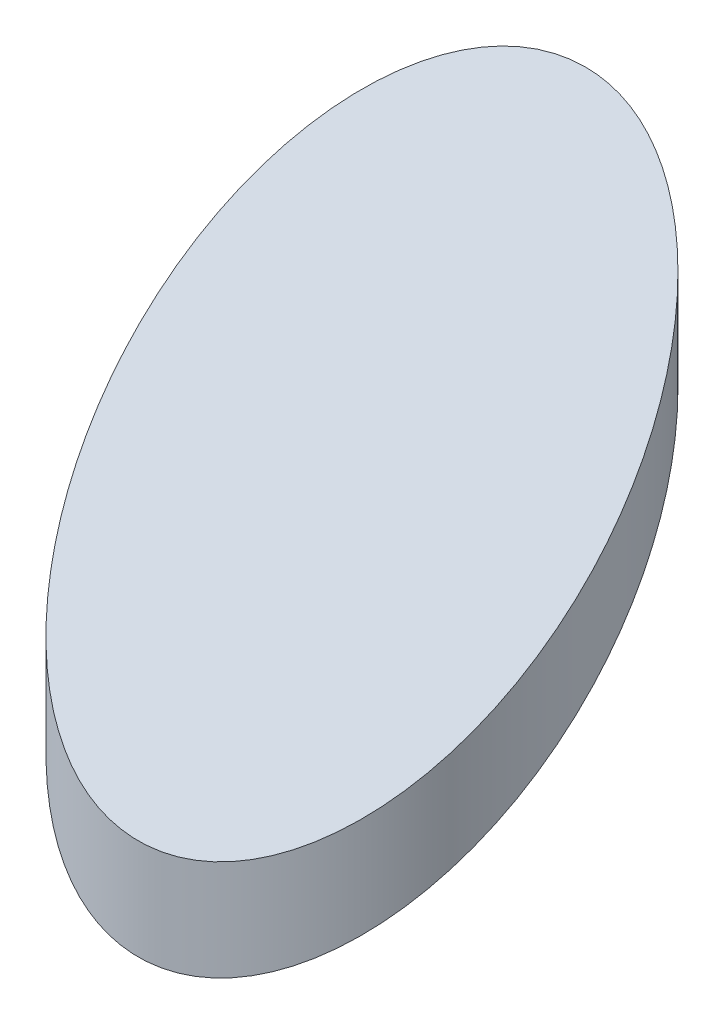
ISO-10303-21;
HEADER;
FILE_DESCRIPTION(('STEP AP214'),'2;1');
FILE_NAME('part.step','',(''),(''),'','','');
FILE_SCHEMA(('AUTOMOTIVE_DESIGN { 1 0 10303 214 1 1 1 1 }'));
ENDSEC;
DATA;
#1=APPLICATION_CONTEXT('core data for automotive mechanical design processes');
#2=APPLICATION_PROTOCOL_DEFINITION('international standard','automotive_design',2000,#1);
#3=PRODUCT_CONTEXT('',#1,'mechanical');
#4=PRODUCT('Part','Part','',(#3));
#5=PRODUCT_RELATED_PRODUCT_CATEGORY('part','',(#4));
#6=PRODUCT_DEFINITION_FORMATION('','',#4);
#7=PRODUCT_DEFINITION_CONTEXT('part definition',#1,'design');
#8=PRODUCT_DEFINITION('design','',#6,#7);
#9=PRODUCT_DEFINITION_SHAPE('','',#8);
#10=(LENGTH_UNIT() NAMED_UNIT(*) SI_UNIT(.MILLI.,.METRE.));
#11=(NAMED_UNIT(*) PLANE_ANGLE_UNIT() SI_UNIT($,.RADIAN.));
#12=(NAMED_UNIT(*) SI_UNIT($,.STERADIAN.) SOLID_ANGLE_UNIT());
#13=UNCERTAINTY_MEASURE_WITH_UNIT(LENGTH_MEASURE(1.E-05),#10,'distance_accuracy_value','');
#14=(GEOMETRIC_REPRESENTATION_CONTEXT(3) GLOBAL_UNCERTAINTY_ASSIGNED_CONTEXT((#13)) GLOBAL_UNIT_ASSIGNED_CONTEXT((#10,
#11,#12)) REPRESENTATION_CONTEXT('',''));
#15=CARTESIAN_POINT('',(0.,0.,0.));
#16=DIRECTION('',(0.,0.,1.));
#17=DIRECTION('',(1.,0.,0.));
#18=AXIS2_PLACEMENT_3D('',#15,#16,#17);
#19=CARTESIAN_POINT('',(0.,14.142135623731,-14.1421356237309));
#20=DIRECTION('',(0.,0.707106781186546,0.707106781186549));
#21=DIRECTION('',(0.,-0.707106781186549,0.707106781186546));
#22=AXIS2_PLACEMENT_3D('',#19,#20,#21);
#23=PLANE('',#22);
#24=CARTESIAN_POINT('',(0.,9.00000000000003,-9.));
#25=DIRECTION('',(0.,0.707106781186546,0.707106781186549));
#26=DIRECTION('',(0.,0.707106781186549,-0.707106781186546));
#27=AXIS2_PLACEMENT_3D('',#24,#25,#26);
#28=ELLIPSE('',#27,8.88126117170305,6.28);
#29=CARTESIAN_POINT('',(0.,15.2800000000001,-15.28));
#30=VERTEX_POINT('',#29);
#31=EDGE_CURVE('E33',#30,#30,#28,.T.);
#32=ORIENTED_EDGE('',*,*,#31,.T.);
#33=EDGE_LOOP('',(#32));
#34=FACE_BOUND('',#33,.T.);
#35=ADVANCED_FACE('F30',(#34),#23,.T.);
#36=CARTESIAN_POINT('',(0.,-1.41421356237309,-9.));
#37=DIRECTION('',(0.,1.,0.));
#38=DIRECTION('',(0.,0.,1.));
#39=AXIS2_PLACEMENT_3D('',#36,#37,#38);
#40=CYLINDRICAL_SURFACE('',#39,6.28);
#41=ORIENTED_EDGE('',*,*,#31,.F.);
#42=EDGE_LOOP('',(#41));
#43=FACE_BOUND('',#42,.T.);
#44=CARTESIAN_POINT('',(0.,6.17157287525384,-9.));
#45=DIRECTION('',(0.,0.707106781186546,0.707106781186549));
#46=DIRECTION('',(0.,0.707106781186549,-0.707106781186546));
#47=AXIS2_PLACEMENT_3D('',#44,#45,#46);
#48=ELLIPSE('',#47,8.88126117170305,6.28);
#49=CARTESIAN_POINT('',(0.,12.4515728752539,-15.28));
#50=VERTEX_POINT('',#49);
#51=EDGE_CURVE('E10',#50,#50,#48,.T.);
#52=ORIENTED_EDGE('',*,*,#51,.T.);
#53=EDGE_LOOP('',(#52));
#54=FACE_BOUND('',#53,.T.);
#55=ADVANCED_FACE('F43',(#43,#54),#40,.T.);
#56=CARTESIAN_POINT('',(0.,12.7279220613579,-15.556349186104));
#57=DIRECTION('',(0.,0.707106781186546,0.707106781186549));
#58=DIRECTION('',(0.,-0.707106781186549,0.707106781186546));
#59=AXIS2_PLACEMENT_3D('',#56,#57,#58);
#60=PLANE('',#59);
#61=ORIENTED_EDGE('',*,*,#51,.F.);
#62=EDGE_LOOP('',(#61));
#63=FACE_BOUND('',#62,.T.);
#64=ADVANCED_FACE('F45',(#63),#60,.F.);
#65=CLOSED_SHELL('',(#35,#55,#64));
#66=MANIFOLD_SOLID_BREP('B2',#65);
#67=ADVANCED_BREP_SHAPE_REPRESENTATION('',(#18,#66),#14);
#68=SHAPE_DEFINITION_REPRESENTATION(#9,#67);
ENDSEC;
END-ISO-10303-21;
